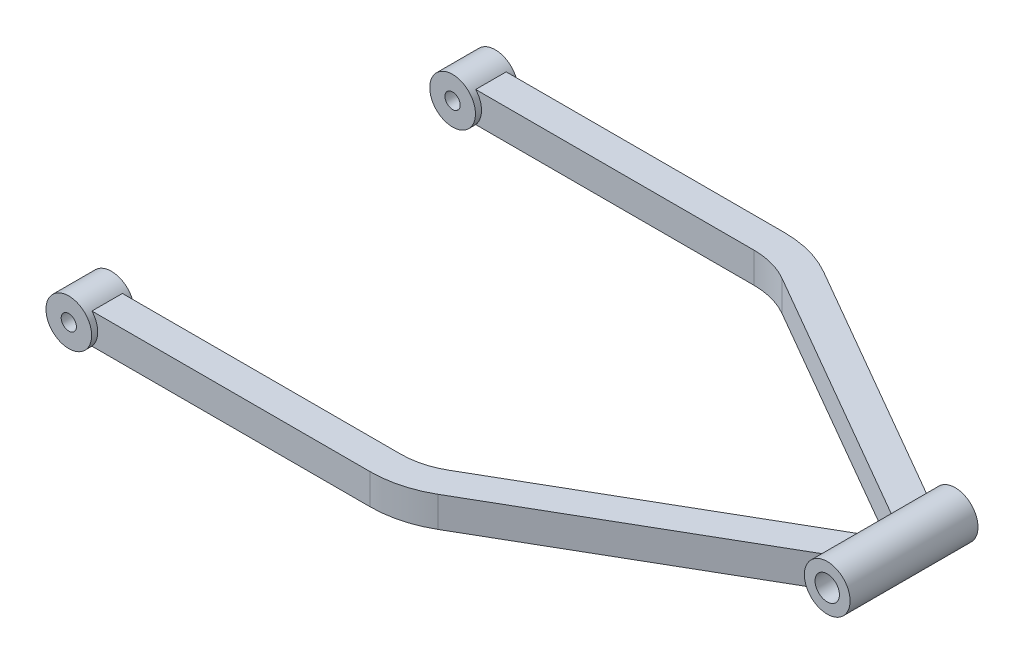
ISO-10303-21;
HEADER;
FILE_DESCRIPTION(('STEP AP214'),'2;1');
FILE_NAME('part.step','',(''),(''),'','','');
FILE_SCHEMA(('AUTOMOTIVE_DESIGN { 1 0 10303 214 1 1 1 1 }'));
ENDSEC;
DATA;
#1=APPLICATION_CONTEXT('core data for automotive mechanical design processes');
#2=APPLICATION_PROTOCOL_DEFINITION('international standard','automotive_design',2000,#1);
#3=PRODUCT_CONTEXT('',#1,'mechanical');
#4=PRODUCT('Part','Part','',(#3));
#5=PRODUCT_RELATED_PRODUCT_CATEGORY('part','',(#4));
#6=PRODUCT_DEFINITION_FORMATION('','',#4);
#7=PRODUCT_DEFINITION_CONTEXT('part definition',#1,'design');
#8=PRODUCT_DEFINITION('design','',#6,#7);
#9=PRODUCT_DEFINITION_SHAPE('','',#8);
#10=(LENGTH_UNIT() NAMED_UNIT(*) SI_UNIT(.MILLI.,.METRE.));
#11=(NAMED_UNIT(*) PLANE_ANGLE_UNIT() SI_UNIT($,.RADIAN.));
#12=(NAMED_UNIT(*) SI_UNIT($,.STERADIAN.) SOLID_ANGLE_UNIT());
#13=UNCERTAINTY_MEASURE_WITH_UNIT(LENGTH_MEASURE(1.E-05),#10,'distance_accuracy_value','');
#14=(GEOMETRIC_REPRESENTATION_CONTEXT(3) GLOBAL_UNCERTAINTY_ASSIGNED_CONTEXT((#13)) GLOBAL_UNIT_ASSIGNED_CONTEXT((#10,
#11,#12)) REPRESENTATION_CONTEXT('',''));
#15=CARTESIAN_POINT('',(0.,0.,0.));
#16=DIRECTION('',(0.,0.,1.));
#17=DIRECTION('',(1.,0.,0.));
#18=AXIS2_PLACEMENT_3D('',#15,#16,#17);
#19=CARTESIAN_POINT('',(200.,0.,21.));
#20=DIRECTION('',(0.,0.,-1.));
#21=DIRECTION('',(-1.,0.,0.));
#22=AXIS2_PLACEMENT_3D('',#19,#20,#21);
#23=CYLINDRICAL_SURFACE('',#22,7.50000000000001);
#24=CARTESIAN_POINT('',(200.,0.,-21.));
#25=DIRECTION('',(0.,0.,1.));
#26=DIRECTION('',(1.,0.,0.));
#27=AXIS2_PLACEMENT_3D('',#24,#25,#26);
#28=CIRCLE('',#27,7.50000000000001);
#29=CARTESIAN_POINT('',(207.5,0.,-21.));
#30=VERTEX_POINT('',#29);
#31=EDGE_CURVE('E228',#30,#30,#28,.T.);
#32=ORIENTED_EDGE('',*,*,#31,.T.);
#33=EDGE_LOOP('',(#32));
#34=FACE_BOUND('',#33,.T.);
#35=CARTESIAN_POINT('',(200.,0.,21.));
#36=DIRECTION('',(0.,0.,1.));
#37=DIRECTION('',(1.,0.,0.));
#38=AXIS2_PLACEMENT_3D('',#35,#36,#37);
#39=CIRCLE('',#38,7.50000000000001);
#40=CARTESIAN_POINT('',(207.5,0.,21.));
#41=VERTEX_POINT('',#40);
#42=EDGE_CURVE('E231',#41,#41,#39,.T.);
#43=ORIENTED_EDGE('',*,*,#42,.F.);
#44=EDGE_LOOP('',(#43));
#45=FACE_BOUND('',#44,.T.);
#46=CARTESIAN_POINT('',(200.,0.,-2.37822173508914));
#47=DIRECTION('',(-0.500000000000001,0.,0.866025403784438));
#48=DIRECTION('',(-0.866025403784438,0.,-0.500000000000001));
#49=AXIS2_PLACEMENT_3D('',#46,#47,#48);
#50=ELLIPSE('',#49,8.66025403784441,7.50000000000001);
#51=CARTESIAN_POINT('',(194.409830056251,-5.,-5.60570785692865));
#52=VERTEX_POINT('',#51);
#53=CARTESIAN_POINT('',(194.409830056251,5.,-5.60570785692865));
#54=VERTEX_POINT('',#53);
#55=EDGE_CURVE('E240',#52,#54,#50,.F.);
#56=ORIENTED_EDGE('',*,*,#55,.F.);
#57=DIRECTION('',(0.,0.,-1.));
#58=VECTOR('',#57,1.);
#59=CARTESIAN_POINT('',(194.409830056251,-5.,21.));
#60=LINE('',#59,#58);
#61=CARTESIAN_POINT('',(194.409830056251,-5.,-17.1527132407212));
#62=VERTEX_POINT('',#61);
#63=EDGE_CURVE('E234',#52,#62,#60,.T.);
#64=ORIENTED_EDGE('',*,*,#63,.T.);
#65=CARTESIAN_POINT('',(200.,0.,-13.9252271188817));
#66=DIRECTION('',(0.500000000000001,0.,-0.866025403784438));
#67=DIRECTION('',(-0.866025403784438,0.,-0.500000000000001));
#68=AXIS2_PLACEMENT_3D('',#65,#66,#67);
#69=ELLIPSE('',#68,8.66025403784441,7.50000000000001);
#70=CARTESIAN_POINT('',(194.409830056251,5.,-17.1527132407212));
#71=VERTEX_POINT('',#70);
#72=EDGE_CURVE('E11',#71,#62,#69,.F.);
#73=ORIENTED_EDGE('',*,*,#72,.F.);
#74=DIRECTION('',(0.,0.,-1.));
#75=VECTOR('',#74,1.);
#76=CARTESIAN_POINT('',(194.409830056251,5.,21.));
#77=LINE('',#76,#75);
#78=EDGE_CURVE('E238',#71,#54,#77,.F.);
#79=ORIENTED_EDGE('',*,*,#78,.T.);
#80=EDGE_LOOP('',(#56,#64,#73,#79));
#81=FACE_BOUND('',#80,.T.);
#82=DIRECTION('',(0.,0.,1.));
#83=VECTOR('',#82,1.);
#84=CARTESIAN_POINT('',(194.409830056251,5.,-21.));
#85=LINE('',#84,#83);
#86=CARTESIAN_POINT('',(194.409830056251,5.,17.1527132407212));
#87=VERTEX_POINT('',#86);
#88=CARTESIAN_POINT('',(194.409830056251,5.,5.6057078569287));
#89=VERTEX_POINT('',#88);
#90=EDGE_CURVE('E57',#87,#89,#85,.F.);
#91=ORIENTED_EDGE('',*,*,#90,.F.);
#92=CARTESIAN_POINT('',(200.,0.,13.9252271188817));
#93=DIRECTION('',(-0.500000000000001,0.,-0.866025403784438));
#94=DIRECTION('',(-0.866025403784438,0.,0.500000000000001));
#95=AXIS2_PLACEMENT_3D('',#92,#93,#94);
#96=ELLIPSE('',#95,8.66025403784441,7.50000000000001);
#97=CARTESIAN_POINT('',(194.409830056251,-5.,17.1527132407212));
#98=VERTEX_POINT('',#97);
#99=EDGE_CURVE('E209',#87,#98,#96,.F.);
#100=ORIENTED_EDGE('',*,*,#99,.T.);
#101=DIRECTION('',(0.,0.,1.));
#102=VECTOR('',#101,1.);
#103=CARTESIAN_POINT('',(194.409830056251,-5.,-21.));
#104=LINE('',#103,#102);
#105=CARTESIAN_POINT('',(194.409830056251,-5.,5.60570785692865));
#106=VERTEX_POINT('',#105);
#107=EDGE_CURVE('E159',#106,#98,#104,.T.);
#108=ORIENTED_EDGE('',*,*,#107,.F.);
#109=CARTESIAN_POINT('',(200.,0.,2.37822173508914));
#110=DIRECTION('',(0.500000000000001,0.,0.866025403784438));
#111=DIRECTION('',(-0.866025403784438,0.,0.500000000000001));
#112=AXIS2_PLACEMENT_3D('',#109,#110,#111);
#113=ELLIPSE('',#112,8.66025403784441,7.50000000000001);
#114=EDGE_CURVE('E52',#106,#89,#113,.F.);
#115=ORIENTED_EDGE('',*,*,#114,.T.);
#116=EDGE_LOOP('',(#91,#100,#108,#115));
#117=FACE_BOUND('',#116,.T.);
#118=ADVANCED_FACE('F37',(#34,#45,#81,#117),#23,.T.);
#119=CARTESIAN_POINT('',(96.9615242270663,5.,-58.));
#120=DIRECTION('',(0.,-1.,0.));
#121=DIRECTION('',(0.,0.,-1.));
#122=AXIS2_PLACEMENT_3D('',#119,#120,#121);
#123=PLANE('',#122);
#124=ORIENTED_EDGE('',*,*,#78,.F.);
#125=DIRECTION('',(0.866025403784438,0.,0.500000000000001));
#126=VECTOR('',#125,1.);
#127=CARTESIAN_POINT('',(114.461524227066,5.,-63.3108891324553));
#128=LINE('',#127,#126);
#129=CARTESIAN_POINT('',(114.461524227066,5.,-63.3108891324553));
#130=VERTEX_POINT('',#129);
#131=EDGE_CURVE('E288',#130,#71,#128,.T.);
#132=ORIENTED_EDGE('',*,*,#131,.F.);
#133=CARTESIAN_POINT('',(96.9615242270663,5.,-33.));
#134=DIRECTION('',(0.,-1.,0.));
#135=DIRECTION('',(0.,0.,-1.));
#136=AXIS2_PLACEMENT_3D('',#133,#134,#135);
#137=CIRCLE('',#136,35.);
#138=CARTESIAN_POINT('',(96.9615242270663,5.,-68.));
#139=VERTEX_POINT('',#138);
#140=EDGE_CURVE('E276',#139,#130,#137,.T.);
#141=ORIENTED_EDGE('',*,*,#140,.F.);
#142=DIRECTION('',(-1.,0.,0.));
#143=VECTOR('',#142,1.);
#144=CARTESIAN_POINT('',(96.9615242270663,5.,-68.));
#145=LINE('',#144,#143);
#146=CARTESIAN_POINT('',(5.59016994374948,5.,-68.));
#147=VERTEX_POINT('',#146);
#148=EDGE_CURVE('E258',#139,#147,#145,.T.);
#149=ORIENTED_EDGE('',*,*,#148,.T.);
#150=DIRECTION('',(0.,0.,-1.));
#151=VECTOR('',#150,1.);
#152=CARTESIAN_POINT('',(5.59016994374948,5.,-56.));
#153=LINE('',#152,#151);
#154=CARTESIAN_POINT('',(5.59016994374948,5.,-58.));
#155=VERTEX_POINT('',#154);
#156=EDGE_CURVE('E45',#147,#155,#153,.F.);
#157=ORIENTED_EDGE('',*,*,#156,.T.);
#158=DIRECTION('',(-1.,0.,0.));
#159=VECTOR('',#158,1.);
#160=CARTESIAN_POINT('',(96.9615242270663,5.,-58.));
#161=LINE('',#160,#159);
#162=CARTESIAN_POINT('',(96.9615242270663,5.,-58.));
#163=VERTEX_POINT('',#162);
#164=EDGE_CURVE('E255',#163,#155,#161,.T.);
#165=ORIENTED_EDGE('',*,*,#164,.F.);
#166=CARTESIAN_POINT('',(96.9615242270663,5.,-33.));
#167=DIRECTION('',(0.,-1.,0.));
#168=DIRECTION('',(0.,0.,-1.));
#169=AXIS2_PLACEMENT_3D('',#166,#167,#168);
#170=CIRCLE('',#169,25.);
#171=CARTESIAN_POINT('',(109.461524227066,5.,-54.650635094611));
#172=VERTEX_POINT('',#171);
#173=EDGE_CURVE('E273',#163,#172,#170,.T.);
#174=ORIENTED_EDGE('',*,*,#173,.T.);
#175=DIRECTION('',(0.866025403784438,0.,0.500000000000001));
#176=VECTOR('',#175,1.);
#177=CARTESIAN_POINT('',(109.461524227066,5.,-54.650635094611));
#178=LINE('',#177,#176);
#179=EDGE_CURVE('E285',#172,#54,#178,.T.);
#180=ORIENTED_EDGE('',*,*,#179,.T.);
#181=EDGE_LOOP('',(#124,#132,#141,#149,#157,#165,#174,#180));
#182=FACE_BOUND('',#181,.T.);
#183=ADVANCED_FACE('F315',(#182),#123,.F.);
#184=CARTESIAN_POINT('',(96.9615242270663,-5.,-58.));
#185=DIRECTION('',(0.,1.,0.));
#186=DIRECTION('',(0.,0.,1.));
#187=AXIS2_PLACEMENT_3D('',#184,#185,#186);
#188=PLANE('',#187);
#189=ORIENTED_EDGE('',*,*,#63,.F.);
#190=DIRECTION('',(0.866025403784438,0.,0.500000000000001));
#191=VECTOR('',#190,1.);
#192=CARTESIAN_POINT('',(109.461524227066,-5.,-54.650635094611));
#193=LINE('',#192,#191);
#194=CARTESIAN_POINT('',(109.461524227066,-5.,-54.650635094611));
#195=VERTEX_POINT('',#194);
#196=EDGE_CURVE('E282',#195,#52,#193,.T.);
#197=ORIENTED_EDGE('',*,*,#196,.F.);
#198=CARTESIAN_POINT('',(96.9615242270663,-5.,-33.));
#199=DIRECTION('',(0.,-1.,0.));
#200=DIRECTION('',(0.,0.,-1.));
#201=AXIS2_PLACEMENT_3D('',#198,#199,#200);
#202=CIRCLE('',#201,25.);
#203=CARTESIAN_POINT('',(96.9615242270663,-5.,-58.));
#204=VERTEX_POINT('',#203);
#205=EDGE_CURVE('E270',#204,#195,#202,.T.);
#206=ORIENTED_EDGE('',*,*,#205,.F.);
#207=DIRECTION('',(-1.,0.,0.));
#208=VECTOR('',#207,1.);
#209=CARTESIAN_POINT('',(96.9615242270663,-5.,-58.));
#210=LINE('',#209,#208);
#211=CARTESIAN_POINT('',(5.59016994374947,-5.,-58.));
#212=VERTEX_POINT('',#211);
#213=EDGE_CURVE('E252',#204,#212,#210,.T.);
#214=ORIENTED_EDGE('',*,*,#213,.T.);
#215=DIRECTION('',(0.,0.,-1.));
#216=VECTOR('',#215,1.);
#217=CARTESIAN_POINT('',(5.59016994374947,-5.,-56.));
#218=LINE('',#217,#216);
#219=CARTESIAN_POINT('',(5.59016994374947,-5.,-68.));
#220=VERTEX_POINT('',#219);
#221=EDGE_CURVE('E307',#212,#220,#218,.T.);
#222=ORIENTED_EDGE('',*,*,#221,.T.);
#223=DIRECTION('',(-1.,0.,0.));
#224=VECTOR('',#223,1.);
#225=CARTESIAN_POINT('',(96.9615242270663,-5.,-68.));
#226=LINE('',#225,#224);
#227=CARTESIAN_POINT('',(96.9615242270663,-5.,-68.));
#228=VERTEX_POINT('',#227);
#229=EDGE_CURVE('E249',#228,#220,#226,.T.);
#230=ORIENTED_EDGE('',*,*,#229,.F.);
#231=CARTESIAN_POINT('',(96.9615242270663,-5.,-33.));
#232=DIRECTION('',(0.,-1.,0.));
#233=DIRECTION('',(0.,0.,-1.));
#234=AXIS2_PLACEMENT_3D('',#231,#232,#233);
#235=CIRCLE('',#234,35.);
#236=CARTESIAN_POINT('',(114.461524227066,-5.,-63.3108891324553));
#237=VERTEX_POINT('',#236);
#238=EDGE_CURVE('E267',#228,#237,#235,.T.);
#239=ORIENTED_EDGE('',*,*,#238,.T.);
#240=DIRECTION('',(0.866025403784438,0.,0.500000000000001));
#241=VECTOR('',#240,1.);
#242=CARTESIAN_POINT('',(114.461524227066,-5.,-63.3108891324553));
#243=LINE('',#242,#241);
#244=EDGE_CURVE('E279',#237,#62,#243,.T.);
#245=ORIENTED_EDGE('',*,*,#244,.T.);
#246=EDGE_LOOP('',(#189,#197,#206,#214,#222,#230,#239,#245));
#247=FACE_BOUND('',#246,.T.);
#248=ADVANCED_FACE('F330',(#247),#188,.F.);
#249=CARTESIAN_POINT('',(109.461524227066,-5.,-54.650635094611));
#250=DIRECTION('',(-0.500000000000001,0.,0.866025403784438));
#251=DIRECTION('',(0.866025403784438,0.,0.500000000000001));
#252=AXIS2_PLACEMENT_3D('',#249,#250,#251);
#253=PLANE('',#252);
#254=ORIENTED_EDGE('',*,*,#196,.T.);
#255=ORIENTED_EDGE('',*,*,#55,.T.);
#256=ORIENTED_EDGE('',*,*,#179,.F.);
#257=DIRECTION('',(0.,-1.,0.));
#258=VECTOR('',#257,1.);
#259=CARTESIAN_POINT('',(109.461524227066,-5.,-54.650635094611));
#260=LINE('',#259,#258);
#261=EDGE_CURVE('E264',#172,#195,#260,.T.);
#262=ORIENTED_EDGE('',*,*,#261,.T.);
#263=EDGE_LOOP('',(#254,#255,#256,#262));
#264=FACE_BOUND('',#263,.T.);
#265=ADVANCED_FACE('F326',(#264),#253,.T.);
#266=CARTESIAN_POINT('',(114.461524227066,-5.,-63.3108891324553));
#267=DIRECTION('',(0.500000000000001,0.,-0.866025403784438));
#268=DIRECTION('',(-0.866025403784438,0.,-0.500000000000001));
#269=AXIS2_PLACEMENT_3D('',#266,#267,#268);
#270=PLANE('',#269);
#271=ORIENTED_EDGE('',*,*,#131,.T.);
#272=ORIENTED_EDGE('',*,*,#72,.T.);
#273=ORIENTED_EDGE('',*,*,#244,.F.);
#274=DIRECTION('',(0.,1.,0.));
#275=VECTOR('',#274,1.);
#276=CARTESIAN_POINT('',(114.461524227066,-5.,-63.3108891324553));
#277=LINE('',#276,#275);
#278=EDGE_CURVE('E261',#237,#130,#277,.T.);
#279=ORIENTED_EDGE('',*,*,#278,.T.);
#280=EDGE_LOOP('',(#271,#272,#273,#279));
#281=FACE_BOUND('',#280,.T.);
#282=ADVANCED_FACE('F334',(#281),#270,.T.);
#283=CARTESIAN_POINT('',(0.,0.,-56.));
#284=DIRECTION('',(0.,0.,-1.));
#285=DIRECTION('',(-1.,0.,0.));
#286=AXIS2_PLACEMENT_3D('',#283,#284,#285);
#287=CYLINDRICAL_SURFACE('',#286,7.5);
#288=CARTESIAN_POINT('',(0.,0.,-70.));
#289=DIRECTION('',(0.,0.,1.));
#290=DIRECTION('',(1.,0.,0.));
#291=AXIS2_PLACEMENT_3D('',#288,#289,#290);
#292=CIRCLE('',#291,7.5);
#293=CARTESIAN_POINT('',(7.5,0.,-70.));
#294=VERTEX_POINT('',#293);
#295=EDGE_CURVE('E301',#294,#294,#292,.T.);
#296=ORIENTED_EDGE('',*,*,#295,.T.);
#297=EDGE_LOOP('',(#296));
#298=FACE_BOUND('',#297,.T.);
#299=CARTESIAN_POINT('',(0.,0.,-56.));
#300=DIRECTION('',(0.,0.,1.));
#301=DIRECTION('',(1.,0.,0.));
#302=AXIS2_PLACEMENT_3D('',#299,#300,#301);
#303=CIRCLE('',#302,7.5);
#304=CARTESIAN_POINT('',(7.5,0.,-56.));
#305=VERTEX_POINT('',#304);
#306=EDGE_CURVE('E304',#305,#305,#303,.T.);
#307=ORIENTED_EDGE('',*,*,#306,.F.);
#308=EDGE_LOOP('',(#307));
#309=FACE_BOUND('',#308,.T.);
#310=CARTESIAN_POINT('',(0.,0.,-68.));
#311=DIRECTION('',(0.,0.,1.));
#312=DIRECTION('',(1.,0.,0.));
#313=AXIS2_PLACEMENT_3D('',#310,#311,#312);
#314=CIRCLE('',#313,7.5);
#315=EDGE_CURVE('E294',#220,#147,#314,.T.);
#316=ORIENTED_EDGE('',*,*,#315,.F.);
#317=ORIENTED_EDGE('',*,*,#221,.F.);
#318=CARTESIAN_POINT('',(0.,0.,-58.));
#319=DIRECTION('',(0.,0.,-1.));
#320=DIRECTION('',(-1.,0.,0.));
#321=AXIS2_PLACEMENT_3D('',#318,#319,#320);
#322=CIRCLE('',#321,7.5);
#323=EDGE_CURVE('E291',#155,#212,#322,.T.);
#324=ORIENTED_EDGE('',*,*,#323,.F.);
#325=ORIENTED_EDGE('',*,*,#156,.F.);
#326=EDGE_LOOP('',(#316,#317,#324,#325));
#327=FACE_BOUND('',#326,.T.);
#328=ADVANCED_FACE('F39',(#298,#309,#327),#287,.T.);
#329=CARTESIAN_POINT('',(0.,0.,-56.));
#330=DIRECTION('',(0.,0.,1.));
#331=DIRECTION('',(1.,0.,0.));
#332=AXIS2_PLACEMENT_3D('',#329,#330,#331);
#333=PLANE('',#332);
#334=ORIENTED_EDGE('',*,*,#306,.T.);
#335=EDGE_LOOP('',(#334));
#336=FACE_BOUND('',#335,.T.);
#337=CARTESIAN_POINT('',(0.,0.,-56.));
#338=DIRECTION('',(0.,0.,1.));
#339=DIRECTION('',(1.,0.,0.));
#340=AXIS2_PLACEMENT_3D('',#337,#338,#339);
#341=CIRCLE('',#340,2.5);
#342=CARTESIAN_POINT('',(2.5,0.,-56.));
#343=VERTEX_POINT('',#342);
#344=EDGE_CURVE('E298',#343,#343,#341,.T.);
#345=ORIENTED_EDGE('',*,*,#344,.F.);
#346=EDGE_LOOP('',(#345));
#347=FACE_BOUND('',#346,.T.);
#348=ADVANCED_FACE('F341',(#336,#347),#333,.T.);
#349=CARTESIAN_POINT('',(0.,0.,-70.));
#350=DIRECTION('',(0.,0.,1.));
#351=DIRECTION('',(1.,0.,0.));
#352=AXIS2_PLACEMENT_3D('',#349,#350,#351);
#353=PLANE('',#352);
#354=ORIENTED_EDGE('',*,*,#295,.F.);
#355=EDGE_LOOP('',(#354));
#356=FACE_BOUND('',#355,.T.);
#357=CARTESIAN_POINT('',(0.,0.,-70.));
#358=DIRECTION('',(0.,0.,1.));
#359=DIRECTION('',(1.,0.,0.));
#360=AXIS2_PLACEMENT_3D('',#357,#358,#359);
#361=CIRCLE('',#360,2.5);
#362=CARTESIAN_POINT('',(2.5,0.,-70.));
#363=VERTEX_POINT('',#362);
#364=EDGE_CURVE('E297',#363,#363,#361,.T.);
#365=ORIENTED_EDGE('',*,*,#364,.T.);
#366=EDGE_LOOP('',(#365));
#367=FACE_BOUND('',#366,.T.);
#368=ADVANCED_FACE('F348',(#356,#367),#353,.F.);
#369=CARTESIAN_POINT('',(0.,0.,-56.));
#370=DIRECTION('',(0.,0.,-1.));
#371=DIRECTION('',(-1.,0.,0.));
#372=AXIS2_PLACEMENT_3D('',#369,#370,#371);
#373=CYLINDRICAL_SURFACE('',#372,2.5);
#374=ORIENTED_EDGE('',*,*,#344,.T.);
#375=EDGE_LOOP('',(#374));
#376=FACE_BOUND('',#375,.T.);
#377=ORIENTED_EDGE('',*,*,#364,.F.);
#378=EDGE_LOOP('',(#377));
#379=FACE_BOUND('',#378,.T.);
#380=ADVANCED_FACE('F372',(#376,#379),#373,.F.);
#381=CARTESIAN_POINT('',(96.9615242270663,-5.,-68.));
#382=DIRECTION('',(0.,0.,1.));
#383=DIRECTION('',(1.,0.,0.));
#384=AXIS2_PLACEMENT_3D('',#381,#382,#383);
#385=PLANE('',#384);
#386=ORIENTED_EDGE('',*,*,#229,.T.);
#387=ORIENTED_EDGE('',*,*,#315,.T.);
#388=ORIENTED_EDGE('',*,*,#148,.F.);
#389=DIRECTION('',(0.,1.,0.));
#390=VECTOR('',#389,1.);
#391=CARTESIAN_POINT('',(96.9615242270663,-5.,-68.));
#392=LINE('',#391,#390);
#393=EDGE_CURVE('E243',#228,#139,#392,.T.);
#394=ORIENTED_EDGE('',*,*,#393,.F.);
#395=EDGE_LOOP('',(#386,#387,#388,#394));
#396=FACE_BOUND('',#395,.T.);
#397=ADVANCED_FACE('F339',(#396),#385,.F.);
#398=CARTESIAN_POINT('',(96.9615242270663,-5.,-58.));
#399=DIRECTION('',(0.,0.,-1.));
#400=DIRECTION('',(-1.,0.,0.));
#401=AXIS2_PLACEMENT_3D('',#398,#399,#400);
#402=PLANE('',#401);
#403=ORIENTED_EDGE('',*,*,#164,.T.);
#404=ORIENTED_EDGE('',*,*,#323,.T.);
#405=ORIENTED_EDGE('',*,*,#213,.F.);
#406=DIRECTION('',(0.,-1.,0.));
#407=VECTOR('',#406,1.);
#408=CARTESIAN_POINT('',(96.9615242270663,-5.,-58.));
#409=LINE('',#408,#407);
#410=EDGE_CURVE('E246',#163,#204,#409,.T.);
#411=ORIENTED_EDGE('',*,*,#410,.F.);
#412=EDGE_LOOP('',(#403,#404,#405,#411));
#413=FACE_BOUND('',#412,.T.);
#414=ADVANCED_FACE('F320',(#413),#402,.F.);
#415=CARTESIAN_POINT('',(96.9615242270663,0.,-33.));
#416=DIRECTION('',(0.,-1.,0.));
#417=DIRECTION('',(0.,0.,-1.));
#418=AXIS2_PLACEMENT_3D('',#415,#416,#417);
#419=CYLINDRICAL_SURFACE('',#418,25.);
#420=ORIENTED_EDGE('',*,*,#410,.T.);
#421=ORIENTED_EDGE('',*,*,#205,.T.);
#422=ORIENTED_EDGE('',*,*,#261,.F.);
#423=ORIENTED_EDGE('',*,*,#173,.F.);
#424=EDGE_LOOP('',(#420,#421,#422,#423));
#425=FACE_BOUND('',#424,.T.);
#426=ADVANCED_FACE('F323',(#425),#419,.F.);
#427=CARTESIAN_POINT('',(96.9615242270663,0.,-33.));
#428=DIRECTION('',(0.,-1.,0.));
#429=DIRECTION('',(0.,0.,-1.));
#430=AXIS2_PLACEMENT_3D('',#427,#428,#429);
#431=CYLINDRICAL_SURFACE('',#430,35.);
#432=ORIENTED_EDGE('',*,*,#393,.T.);
#433=ORIENTED_EDGE('',*,*,#140,.T.);
#434=ORIENTED_EDGE('',*,*,#278,.F.);
#435=ORIENTED_EDGE('',*,*,#238,.F.);
#436=EDGE_LOOP('',(#432,#433,#434,#435));
#437=FACE_BOUND('',#436,.T.);
#438=ADVANCED_FACE('F336',(#437),#431,.T.);
#439=CARTESIAN_POINT('',(200.,0.,21.));
#440=DIRECTION('',(0.,0.,-1.));
#441=DIRECTION('',(-1.,0.,0.));
#442=AXIS2_PLACEMENT_3D('',#439,#440,#441);
#443=CYLINDRICAL_SURFACE('',#442,3.99999999999999);
#444=CARTESIAN_POINT('',(200.,0.,-21.));
#445=DIRECTION('',(0.,0.,1.));
#446=DIRECTION('',(1.,0.,0.));
#447=AXIS2_PLACEMENT_3D('',#444,#445,#446);
#448=CIRCLE('',#447,3.99999999999999);
#449=CARTESIAN_POINT('',(196.,0.,-21.));
#450=VERTEX_POINT('',#449);
#451=EDGE_CURVE('E224',#450,#450,#448,.T.);
#452=CARTESIAN_POINT('',(200.,0.,21.));
#453=DIRECTION('',(0.,0.,1.));
#454=DIRECTION('',(1.,0.,0.));
#455=AXIS2_PLACEMENT_3D('',#452,#453,#454);
#456=CIRCLE('',#455,3.99999999999999);
#457=CARTESIAN_POINT('',(196.,0.,21.));
#458=VERTEX_POINT('',#457);
#459=EDGE_CURVE('E225',#458,#458,#456,.T.);
#460=CARTESIAN_POINT('',(196.,0.,-21.));
#461=CARTESIAN_POINT('',(196.,0.,-20.5625));
#462=CARTESIAN_POINT('',(196.,0.,-20.125));
#463=CARTESIAN_POINT('',(196.,0.,-19.25));
#464=CARTESIAN_POINT('',(196.,0.,-18.8125));
#465=CARTESIAN_POINT('',(196.,0.,-17.9375));
#466=CARTESIAN_POINT('',(196.,0.,-17.5));
#467=CARTESIAN_POINT('',(196.,0.,-16.625));
#468=CARTESIAN_POINT('',(196.,0.,-16.1875));
#469=CARTESIAN_POINT('',(196.,0.,-15.3125));
#470=CARTESIAN_POINT('',(196.,0.,-14.875));
#471=CARTESIAN_POINT('',(196.,0.,-14.));
#472=CARTESIAN_POINT('',(196.,0.,-13.5625));
#473=CARTESIAN_POINT('',(196.,0.,-12.6875));
#474=CARTESIAN_POINT('',(196.,0.,-12.25));
#475=CARTESIAN_POINT('',(196.,0.,-11.375));
#476=CARTESIAN_POINT('',(196.,0.,-10.9375));
#477=CARTESIAN_POINT('',(196.,0.,-10.0625));
#478=CARTESIAN_POINT('',(196.,0.,-9.625));
#479=CARTESIAN_POINT('',(196.,0.,-8.75));
#480=CARTESIAN_POINT('',(196.,0.,-8.3125));
#481=CARTESIAN_POINT('',(196.,0.,-7.4375));
#482=CARTESIAN_POINT('',(196.,0.,-7.));
#483=CARTESIAN_POINT('',(196.,0.,-6.125));
#484=CARTESIAN_POINT('',(196.,0.,-5.6875));
#485=CARTESIAN_POINT('',(196.,0.,-4.8125));
#486=CARTESIAN_POINT('',(196.,0.,-4.375));
#487=CARTESIAN_POINT('',(196.,0.,-3.5));
#488=CARTESIAN_POINT('',(196.,0.,-3.0625));
#489=CARTESIAN_POINT('',(196.,0.,-2.1875));
#490=CARTESIAN_POINT('',(196.,0.,-1.75));
#491=CARTESIAN_POINT('',(196.,0.,-0.875000000000001));
#492=CARTESIAN_POINT('',(196.,0.,-0.4375));
#493=CARTESIAN_POINT('',(196.,0.,0.4375));
#494=CARTESIAN_POINT('',(196.,0.,0.875000000000001));
#495=CARTESIAN_POINT('',(196.,0.,1.75));
#496=CARTESIAN_POINT('',(196.,0.,2.1875));
#497=CARTESIAN_POINT('',(196.,0.,3.0625));
#498=CARTESIAN_POINT('',(196.,0.,3.5));
#499=CARTESIAN_POINT('',(196.,0.,4.375));
#500=CARTESIAN_POINT('',(196.,0.,4.8125));
#501=CARTESIAN_POINT('',(196.,0.,5.6875));
#502=CARTESIAN_POINT('',(196.,0.,6.125));
#503=CARTESIAN_POINT('',(196.,0.,7.));
#504=CARTESIAN_POINT('',(196.,0.,7.4375));
#505=CARTESIAN_POINT('',(196.,0.,8.3125));
#506=CARTESIAN_POINT('',(196.,0.,8.75));
#507=CARTESIAN_POINT('',(196.,0.,9.625));
#508=CARTESIAN_POINT('',(196.,0.,10.0625));
#509=CARTESIAN_POINT('',(196.,0.,10.9375));
#510=CARTESIAN_POINT('',(196.,0.,11.375));
#511=CARTESIAN_POINT('',(196.,0.,12.25));
#512=CARTESIAN_POINT('',(196.,0.,12.6875));
#513=CARTESIAN_POINT('',(196.,0.,13.5625));
#514=CARTESIAN_POINT('',(196.,0.,14.));
#515=CARTESIAN_POINT('',(196.,0.,14.875));
#516=CARTESIAN_POINT('',(196.,0.,15.3125));
#517=CARTESIAN_POINT('',(196.,0.,16.1875));
#518=CARTESIAN_POINT('',(196.,0.,16.625));
#519=CARTESIAN_POINT('',(196.,0.,17.5));
#520=CARTESIAN_POINT('',(196.,0.,17.9375));
#521=CARTESIAN_POINT('',(196.,0.,18.8125));
#522=CARTESIAN_POINT('',(196.,0.,19.25));
#523=CARTESIAN_POINT('',(196.,0.,20.125));
#524=CARTESIAN_POINT('',(196.,0.,20.5625));
#525=CARTESIAN_POINT('',(196.,0.,21.));
#526=B_SPLINE_CURVE_WITH_KNOTS('',3,(#460,#461,#462,#463,#464,#465,#466,#467,#468,#469,#470,
#471,#472,#473,#474,#475,#476,#477,#478,#479,#480,#481,#482,#483,#484,#485,#486,#487,#488,#489,
#490,#491,#492,#493,#494,#495,#496,#497,#498,#499,#500,#501,#502,#503,#504,#505,#506,#507,#508,
#509,#510,#511,#512,#513,#514,#515,#516,#517,#518,#519,#520,#521,#522,#523,#524,#525),
.UNSPECIFIED.,.F.,.F.,(4,2,2,2,2,2,2,2,2,2,2,2,2,2,2,2,2,2,2,2,2,2,2,2,2,2,2,2,2,2,2,2,4),(0.,
1.3125,2.625,3.9375,5.25,6.5625,7.875,9.1875,10.5,11.8125,13.125,14.4375,15.75,17.0625,18.375,
19.6875,21.,22.3125,23.625,24.9375,26.25,27.5625,28.875,30.1875,31.5,32.8125,34.125,35.4375,
36.75,38.0625,39.375,40.6875,42.),.UNSPECIFIED.);
#527=EDGE_CURVE('BSEAM375',#450,#458,#526,.T.);
#528=ORIENTED_EDGE('',*,*,#451,.F.);
#529=ORIENTED_EDGE('',*,*,#459,.T.);
#530=ORIENTED_EDGE('',*,*,#527,.T.);
#531=ORIENTED_EDGE('',*,*,#527,.F.);
#532=EDGE_LOOP('',(#528,#530,#529,#531));
#533=FACE_BOUND('',#532,.T.);
#534=ADVANCED_FACE('F375',(#533),#443,.F.);
#535=CARTESIAN_POINT('',(200.,0.,21.));
#536=DIRECTION('',(0.,0.,1.));
#537=DIRECTION('',(1.,0.,0.));
#538=AXIS2_PLACEMENT_3D('',#535,#536,#537);
#539=PLANE('',#538);
#540=ORIENTED_EDGE('',*,*,#42,.T.);
#541=EDGE_LOOP('',(#540));
#542=FACE_BOUND('',#541,.T.);
#543=ORIENTED_EDGE('',*,*,#459,.F.);
#544=EDGE_LOOP('',(#543));
#545=FACE_BOUND('',#544,.T.);
#546=ADVANCED_FACE('F546',(#542,#545),#539,.T.);
#547=CARTESIAN_POINT('',(200.,0.,-21.));
#548=DIRECTION('',(0.,0.,1.));
#549=DIRECTION('',(1.,0.,0.));
#550=AXIS2_PLACEMENT_3D('',#547,#548,#549);
#551=PLANE('',#550);
#552=ORIENTED_EDGE('',*,*,#31,.F.);
#553=EDGE_LOOP('',(#552));
#554=FACE_BOUND('',#553,.T.);
#555=ORIENTED_EDGE('',*,*,#451,.T.);
#556=EDGE_LOOP('',(#555));
#557=FACE_BOUND('',#556,.T.);
#558=ADVANCED_FACE('F365',(#554,#557),#551,.F.);
#559=CARTESIAN_POINT('',(0.,0.,56.));
#560=DIRECTION('',(0.,0.,-1.));
#561=DIRECTION('',(1.,0.,0.));
#562=AXIS2_PLACEMENT_3D('',#559,#560,#561);
#563=PLANE('',#562);
#564=CARTESIAN_POINT('',(0.,0.,56.));
#565=DIRECTION('',(0.,0.,1.));
#566=DIRECTION('',(1.,0.,0.));
#567=AXIS2_PLACEMENT_3D('',#564,#565,#566);
#568=CIRCLE('',#567,7.5);
#569=CARTESIAN_POINT('',(7.5,0.,56.));
#570=VERTEX_POINT('',#569);
#571=EDGE_CURVE('E215',#570,#570,#568,.T.);
#572=ORIENTED_EDGE('',*,*,#571,.F.);
#573=EDGE_LOOP('',(#572));
#574=FACE_BOUND('',#573,.T.);
#575=CARTESIAN_POINT('',(0.,0.,56.));
#576=DIRECTION('',(0.,0.,1.));
#577=DIRECTION('',(1.,0.,0.));
#578=AXIS2_PLACEMENT_3D('',#575,#576,#577);
#579=CIRCLE('',#578,2.5);
#580=CARTESIAN_POINT('',(2.5,0.,56.));
#581=VERTEX_POINT('',#580);
#582=EDGE_CURVE('E221',#581,#581,#579,.T.);
#583=ORIENTED_EDGE('',*,*,#582,.T.);
#584=EDGE_LOOP('',(#583));
#585=FACE_BOUND('',#584,.T.);
#586=ADVANCED_FACE('F434',(#574,#585),#563,.T.);
#587=CARTESIAN_POINT('',(0.,0.,56.));
#588=DIRECTION('',(0.,0.,1.));
#589=DIRECTION('',(-1.,0.,0.));
#590=AXIS2_PLACEMENT_3D('',#587,#588,#589);
#591=CYLINDRICAL_SURFACE('',#590,2.5);
#592=ORIENTED_EDGE('',*,*,#582,.F.);
#593=EDGE_LOOP('',(#592));
#594=FACE_BOUND('',#593,.T.);
#595=CARTESIAN_POINT('',(0.,0.,70.));
#596=DIRECTION('',(0.,0.,1.));
#597=DIRECTION('',(1.,0.,0.));
#598=AXIS2_PLACEMENT_3D('',#595,#596,#597);
#599=CIRCLE('',#598,2.5);
#600=CARTESIAN_POINT('',(2.5,0.,70.));
#601=VERTEX_POINT('',#600);
#602=EDGE_CURVE('E218',#601,#601,#599,.T.);
#603=ORIENTED_EDGE('',*,*,#602,.T.);
#604=EDGE_LOOP('',(#603));
#605=FACE_BOUND('',#604,.T.);
#606=ADVANCED_FACE('F438',(#594,#605),#591,.F.);
#607=CARTESIAN_POINT('',(0.,0.,70.));
#608=DIRECTION('',(0.,0.,-1.));
#609=DIRECTION('',(1.,0.,0.));
#610=AXIS2_PLACEMENT_3D('',#607,#608,#609);
#611=PLANE('',#610);
#612=CARTESIAN_POINT('',(0.,0.,70.));
#613=DIRECTION('',(0.,0.,1.));
#614=DIRECTION('',(1.,0.,0.));
#615=AXIS2_PLACEMENT_3D('',#612,#613,#614);
#616=CIRCLE('',#615,7.5);
#617=CARTESIAN_POINT('',(7.5,0.,70.));
#618=VERTEX_POINT('',#617);
#619=EDGE_CURVE('E212',#618,#618,#616,.T.);
#620=ORIENTED_EDGE('',*,*,#619,.T.);
#621=EDGE_LOOP('',(#620));
#622=FACE_BOUND('',#621,.T.);
#623=ORIENTED_EDGE('',*,*,#602,.F.);
#624=EDGE_LOOP('',(#623));
#625=FACE_BOUND('',#624,.T.);
#626=ADVANCED_FACE('F448',(#622,#625),#611,.F.);
#627=CARTESIAN_POINT('',(0.,0.,56.));
#628=DIRECTION('',(0.,0.,1.));
#629=DIRECTION('',(-1.,0.,0.));
#630=AXIS2_PLACEMENT_3D('',#627,#628,#629);
#631=CYLINDRICAL_SURFACE('',#630,7.5);
#632=ORIENTED_EDGE('',*,*,#619,.F.);
#633=EDGE_LOOP('',(#632));
#634=FACE_BOUND('',#633,.T.);
#635=ORIENTED_EDGE('',*,*,#571,.T.);
#636=EDGE_LOOP('',(#635));
#637=FACE_BOUND('',#636,.T.);
#638=CARTESIAN_POINT('',(0.,0.,68.));
#639=DIRECTION('',(0.,0.,1.));
#640=DIRECTION('',(1.,0.,0.));
#641=AXIS2_PLACEMENT_3D('',#638,#639,#640);
#642=CIRCLE('',#641,7.5);
#643=CARTESIAN_POINT('',(5.59016994374947,-5.,68.));
#644=VERTEX_POINT('',#643);
#645=CARTESIAN_POINT('',(5.59016994374948,5.,68.));
#646=VERTEX_POINT('',#645);
#647=EDGE_CURVE('E173',#644,#646,#642,.T.);
#648=ORIENTED_EDGE('',*,*,#647,.T.);
#649=DIRECTION('',(0.,0.,1.));
#650=VECTOR('',#649,1.);
#651=CARTESIAN_POINT('',(5.59016994374948,5.,56.));
#652=LINE('',#651,#650);
#653=CARTESIAN_POINT('',(5.59016994374948,5.,58.));
#654=VERTEX_POINT('',#653);
#655=EDGE_CURVE('E170',#646,#654,#652,.F.);
#656=ORIENTED_EDGE('',*,*,#655,.T.);
#657=CARTESIAN_POINT('',(0.,0.,58.));
#658=DIRECTION('',(0.,0.,-1.));
#659=DIRECTION('',(-1.,0.,0.));
#660=AXIS2_PLACEMENT_3D('',#657,#658,#659);
#661=CIRCLE('',#660,7.5);
#662=CARTESIAN_POINT('',(5.59016994374947,-5.,58.));
#663=VERTEX_POINT('',#662);
#664=EDGE_CURVE('E200',#654,#663,#661,.T.);
#665=ORIENTED_EDGE('',*,*,#664,.T.);
#666=DIRECTION('',(0.,0.,1.));
#667=VECTOR('',#666,1.);
#668=CARTESIAN_POINT('',(5.59016994374947,-5.,56.));
#669=LINE('',#668,#667);
#670=EDGE_CURVE('E184',#663,#644,#669,.T.);
#671=ORIENTED_EDGE('',*,*,#670,.T.);
#672=EDGE_LOOP('',(#648,#656,#665,#671));
#673=FACE_BOUND('',#672,.T.);
#674=ADVANCED_FACE('F458',(#634,#637,#673),#631,.T.);
#675=CARTESIAN_POINT('',(109.461524227066,-5.,54.650635094611));
#676=DIRECTION('',(-0.500000000000001,0.,-0.866025403784438));
#677=DIRECTION('',(0.866025403784438,0.,-0.500000000000001));
#678=AXIS2_PLACEMENT_3D('',#675,#676,#677);
#679=PLANE('',#678);
#680=DIRECTION('',(0.866025403784438,0.,-0.500000000000001));
#681=VECTOR('',#680,1.);
#682=CARTESIAN_POINT('',(109.461524227066,-5.,54.650635094611));
#683=LINE('',#682,#681);
#684=CARTESIAN_POINT('',(109.461524227066,-5.,54.650635094611));
#685=VERTEX_POINT('',#684);
#686=EDGE_CURVE('E172',#685,#106,#683,.T.);
#687=ORIENTED_EDGE('',*,*,#686,.F.);
#688=DIRECTION('',(0.,-1.,0.));
#689=VECTOR('',#688,1.);
#690=CARTESIAN_POINT('',(109.461524227066,-5.,54.650635094611));
#691=LINE('',#690,#689);
#692=CARTESIAN_POINT('',(109.461524227066,5.,54.650635094611));
#693=VERTEX_POINT('',#692);
#694=EDGE_CURVE('E193',#693,#685,#691,.T.);
#695=ORIENTED_EDGE('',*,*,#694,.F.);
#696=DIRECTION('',(0.866025403784438,0.,-0.500000000000001));
#697=VECTOR('',#696,1.);
#698=CARTESIAN_POINT('',(109.461524227066,5.,54.650635094611));
#699=LINE('',#698,#697);
#700=EDGE_CURVE('E207',#693,#89,#699,.T.);
#701=ORIENTED_EDGE('',*,*,#700,.T.);
#702=ORIENTED_EDGE('',*,*,#114,.F.);
#703=EDGE_LOOP('',(#687,#695,#701,#702));
#704=FACE_BOUND('',#703,.T.);
#705=ADVANCED_FACE('F466',(#704),#679,.T.);
#706=CARTESIAN_POINT('',(114.461524227066,-5.,63.3108891324553));
#707=DIRECTION('',(0.500000000000001,0.,0.866025403784438));
#708=DIRECTION('',(-0.866025403784438,0.,0.500000000000001));
#709=AXIS2_PLACEMENT_3D('',#706,#707,#708);
#710=PLANE('',#709);
#711=DIRECTION('',(0.866025403784438,0.,-0.500000000000001));
#712=VECTOR('',#711,1.);
#713=CARTESIAN_POINT('',(114.461524227066,5.,63.3108891324553));
#714=LINE('',#713,#712);
#715=CARTESIAN_POINT('',(114.461524227066,5.,63.3108891324553));
#716=VERTEX_POINT('',#715);
#717=EDGE_CURVE('E204',#716,#87,#714,.T.);
#718=ORIENTED_EDGE('',*,*,#717,.F.);
#719=DIRECTION('',(0.,1.,0.));
#720=VECTOR('',#719,1.);
#721=CARTESIAN_POINT('',(114.461524227066,-5.,63.3108891324553));
#722=LINE('',#721,#720);
#723=CARTESIAN_POINT('',(114.461524227066,-5.,63.3108891324553));
#724=VERTEX_POINT('',#723);
#725=EDGE_CURVE('E164',#724,#716,#722,.T.);
#726=ORIENTED_EDGE('',*,*,#725,.F.);
#727=DIRECTION('',(0.866025403784438,0.,-0.500000000000001));
#728=VECTOR('',#727,1.);
#729=CARTESIAN_POINT('',(114.461524227066,-5.,63.3108891324553));
#730=LINE('',#729,#728);
#731=EDGE_CURVE('E187',#724,#98,#730,.T.);
#732=ORIENTED_EDGE('',*,*,#731,.T.);
#733=ORIENTED_EDGE('',*,*,#99,.F.);
#734=EDGE_LOOP('',(#718,#726,#732,#733));
#735=FACE_BOUND('',#734,.T.);
#736=ADVANCED_FACE('F474',(#735),#710,.T.);
#737=CARTESIAN_POINT('',(96.9615242270663,5.,58.));
#738=DIRECTION('',(0.,-1.,0.));
#739=DIRECTION('',(0.,0.,1.));
#740=AXIS2_PLACEMENT_3D('',#737,#738,#739);
#741=PLANE('',#740);
#742=ORIENTED_EDGE('',*,*,#90,.T.);
#743=ORIENTED_EDGE('',*,*,#700,.F.);
#744=CARTESIAN_POINT('',(96.9615242270663,5.,33.));
#745=DIRECTION('',(0.,1.,0.));
#746=DIRECTION('',(0.,0.,1.));
#747=AXIS2_PLACEMENT_3D('',#744,#745,#746);
#748=CIRCLE('',#747,25.);
#749=CARTESIAN_POINT('',(96.9615242270663,5.,58.));
#750=VERTEX_POINT('',#749);
#751=EDGE_CURVE('E196',#750,#693,#748,.T.);
#752=ORIENTED_EDGE('',*,*,#751,.F.);
#753=DIRECTION('',(-1.,0.,0.));
#754=VECTOR('',#753,1.);
#755=CARTESIAN_POINT('',(96.9615242270663,5.,58.));
#756=LINE('',#755,#754);
#757=EDGE_CURVE('E198',#750,#654,#756,.T.);
#758=ORIENTED_EDGE('',*,*,#757,.T.);
#759=ORIENTED_EDGE('',*,*,#655,.F.);
#760=DIRECTION('',(-1.,0.,0.));
#761=VECTOR('',#760,1.);
#762=CARTESIAN_POINT('',(96.9615242270663,5.,68.));
#763=LINE('',#762,#761);
#764=CARTESIAN_POINT('',(96.9615242270663,5.,68.));
#765=VERTEX_POINT('',#764);
#766=EDGE_CURVE('E153',#765,#646,#763,.T.);
#767=ORIENTED_EDGE('',*,*,#766,.F.);
#768=CARTESIAN_POINT('',(96.9615242270663,5.,33.));
#769=DIRECTION('',(0.,1.,0.));
#770=DIRECTION('',(0.,0.,1.));
#771=AXIS2_PLACEMENT_3D('',#768,#769,#770);
#772=CIRCLE('',#771,35.);
#773=EDGE_CURVE('E158',#765,#716,#772,.T.);
#774=ORIENTED_EDGE('',*,*,#773,.T.);
#775=ORIENTED_EDGE('',*,*,#717,.T.);
#776=EDGE_LOOP('',(#742,#743,#752,#758,#759,#767,#774,#775));
#777=FACE_BOUND('',#776,.T.);
#778=ADVANCED_FACE('F168',(#777),#741,.F.);
#779=CARTESIAN_POINT('',(96.9615242270663,-5.,58.));
#780=DIRECTION('',(0.,0.,1.));
#781=DIRECTION('',(-1.,0.,0.));
#782=AXIS2_PLACEMENT_3D('',#779,#780,#781);
#783=PLANE('',#782);
#784=ORIENTED_EDGE('',*,*,#757,.F.);
#785=DIRECTION('',(0.,-1.,0.));
#786=VECTOR('',#785,1.);
#787=CARTESIAN_POINT('',(96.9615242270663,-5.,58.));
#788=LINE('',#787,#786);
#789=CARTESIAN_POINT('',(96.9615242270663,-5.,58.));
#790=VERTEX_POINT('',#789);
#791=EDGE_CURVE('E190',#750,#790,#788,.T.);
#792=ORIENTED_EDGE('',*,*,#791,.T.);
#793=DIRECTION('',(-1.,0.,0.));
#794=VECTOR('',#793,1.);
#795=CARTESIAN_POINT('',(96.9615242270663,-5.,58.));
#796=LINE('',#795,#794);
#797=EDGE_CURVE('E182',#790,#663,#796,.T.);
#798=ORIENTED_EDGE('',*,*,#797,.T.);
#799=ORIENTED_EDGE('',*,*,#664,.F.);
#800=EDGE_LOOP('',(#784,#792,#798,#799));
#801=FACE_BOUND('',#800,.T.);
#802=ADVANCED_FACE('F489',(#801),#783,.F.);
#803=CARTESIAN_POINT('',(96.9615242270663,0.,33.));
#804=DIRECTION('',(0.,-1.,0.));
#805=DIRECTION('',(0.,0.,1.));
#806=AXIS2_PLACEMENT_3D('',#803,#804,#805);
#807=CYLINDRICAL_SURFACE('',#806,25.);
#808=ORIENTED_EDGE('',*,*,#791,.F.);
#809=ORIENTED_EDGE('',*,*,#751,.T.);
#810=ORIENTED_EDGE('',*,*,#694,.T.);
#811=CARTESIAN_POINT('',(96.9615242270663,-5.,33.));
#812=DIRECTION('',(0.,1.,0.));
#813=DIRECTION('',(0.,0.,1.));
#814=AXIS2_PLACEMENT_3D('',#811,#812,#813);
#815=CIRCLE('',#814,25.);
#816=EDGE_CURVE('E176',#790,#685,#815,.T.);
#817=ORIENTED_EDGE('',*,*,#816,.F.);
#818=EDGE_LOOP('',(#808,#809,#810,#817));
#819=FACE_BOUND('',#818,.T.);
#820=ADVANCED_FACE('F502',(#819),#807,.F.);
#821=CARTESIAN_POINT('',(96.9615242270663,-5.,58.));
#822=DIRECTION('',(0.,1.,0.));
#823=DIRECTION('',(0.,0.,-1.));
#824=AXIS2_PLACEMENT_3D('',#821,#822,#823);
#825=PLANE('',#824);
#826=ORIENTED_EDGE('',*,*,#107,.T.);
#827=ORIENTED_EDGE('',*,*,#731,.F.);
#828=CARTESIAN_POINT('',(96.9615242270663,-5.,33.));
#829=DIRECTION('',(0.,1.,0.));
#830=DIRECTION('',(0.,0.,1.));
#831=AXIS2_PLACEMENT_3D('',#828,#829,#830);
#832=CIRCLE('',#831,35.);
#833=CARTESIAN_POINT('',(96.9615242270663,-5.,68.));
#834=VERTEX_POINT('',#833);
#835=EDGE_CURVE('E584',#834,#724,#832,.T.);
#836=ORIENTED_EDGE('',*,*,#835,.F.);
#837=DIRECTION('',(-1.,0.,0.));
#838=VECTOR('',#837,1.);
#839=CARTESIAN_POINT('',(96.9615242270663,-5.,68.));
#840=LINE('',#839,#838);
#841=EDGE_CURVE('E155',#834,#644,#840,.T.);
#842=ORIENTED_EDGE('',*,*,#841,.T.);
#843=ORIENTED_EDGE('',*,*,#670,.F.);
#844=ORIENTED_EDGE('',*,*,#797,.F.);
#845=ORIENTED_EDGE('',*,*,#816,.T.);
#846=ORIENTED_EDGE('',*,*,#686,.T.);
#847=EDGE_LOOP('',(#826,#827,#836,#842,#843,#844,#845,#846));
#848=FACE_BOUND('',#847,.T.);
#849=ADVANCED_FACE('F510',(#848),#825,.F.);
#850=CARTESIAN_POINT('',(96.9615242270663,-5.,68.));
#851=DIRECTION('',(0.,0.,-1.));
#852=DIRECTION('',(1.,0.,0.));
#853=AXIS2_PLACEMENT_3D('',#850,#851,#852);
#854=PLANE('',#853);
#855=ORIENTED_EDGE('',*,*,#841,.F.);
#856=DIRECTION('',(0.,1.,0.));
#857=VECTOR('',#856,1.);
#858=CARTESIAN_POINT('',(96.9615242270663,-5.,68.));
#859=LINE('',#858,#857);
#860=EDGE_CURVE('E148',#834,#765,#859,.T.);
#861=ORIENTED_EDGE('',*,*,#860,.T.);
#862=ORIENTED_EDGE('',*,*,#766,.T.);
#863=ORIENTED_EDGE('',*,*,#647,.F.);
#864=EDGE_LOOP('',(#855,#861,#862,#863));
#865=FACE_BOUND('',#864,.T.);
#866=ADVANCED_FACE('F150',(#865),#854,.F.);
#867=CARTESIAN_POINT('',(96.9615242270663,0.,33.));
#868=DIRECTION('',(0.,-1.,0.));
#869=DIRECTION('',(0.,0.,1.));
#870=AXIS2_PLACEMENT_3D('',#867,#868,#869);
#871=CYLINDRICAL_SURFACE('',#870,35.);
#872=ORIENTED_EDGE('',*,*,#860,.F.);
#873=ORIENTED_EDGE('',*,*,#835,.T.);
#874=ORIENTED_EDGE('',*,*,#725,.T.);
#875=ORIENTED_EDGE('',*,*,#773,.F.);
#876=EDGE_LOOP('',(#872,#873,#874,#875));
#877=FACE_BOUND('',#876,.T.);
#878=ADVANCED_FACE('F162',(#877),#871,.T.);
#879=CLOSED_SHELL('',(#118,#183,#248,#265,#282,#328,#348,#368,#380,#397,#414,#426,#438,#534,
#546,#558,#586,#606,#626,#674,#705,#736,#778,#802,#820,#849,#866,#878));
#880=MANIFOLD_SOLID_BREP('B2',#879);
#881=ADVANCED_BREP_SHAPE_REPRESENTATION('',(#18,#880),#14);
#882=SHAPE_DEFINITION_REPRESENTATION(#9,#881);
ENDSEC;
END-ISO-10303-21;
